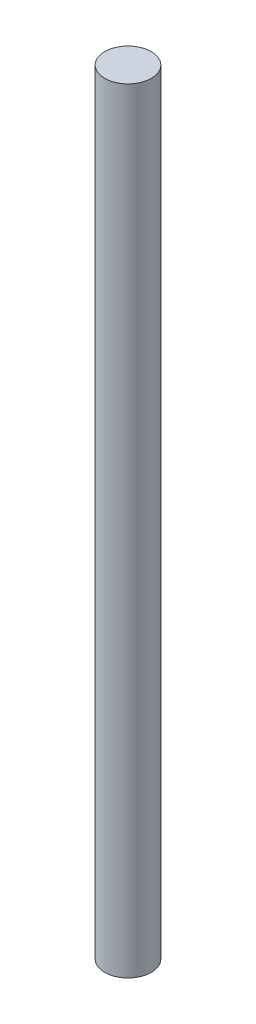
ISO-10303-21;
HEADER;
FILE_DESCRIPTION(('STEP AP214'),'2;1');
FILE_NAME('part.step','',(''),(''),'','','');
FILE_SCHEMA(('AUTOMOTIVE_DESIGN { 1 0 10303 214 1 1 1 1 }'));
ENDSEC;
DATA;
#1=APPLICATION_CONTEXT('core data for automotive mechanical design processes');
#2=APPLICATION_PROTOCOL_DEFINITION('international standard','automotive_design',2000,#1);
#3=PRODUCT_CONTEXT('',#1,'mechanical');
#4=PRODUCT('Part','Part','',(#3));
#5=PRODUCT_RELATED_PRODUCT_CATEGORY('part','',(#4));
#6=PRODUCT_DEFINITION_FORMATION('','',#4);
#7=PRODUCT_DEFINITION_CONTEXT('part definition',#1,'design');
#8=PRODUCT_DEFINITION('design','',#6,#7);
#9=PRODUCT_DEFINITION_SHAPE('','',#8);
#10=(LENGTH_UNIT() NAMED_UNIT(*) SI_UNIT(.MILLI.,.METRE.));
#11=(NAMED_UNIT(*) PLANE_ANGLE_UNIT() SI_UNIT($,.RADIAN.));
#12=(NAMED_UNIT(*) SI_UNIT($,.STERADIAN.) SOLID_ANGLE_UNIT());
#13=UNCERTAINTY_MEASURE_WITH_UNIT(LENGTH_MEASURE(1.E-05),#10,'distance_accuracy_value','');
#14=(GEOMETRIC_REPRESENTATION_CONTEXT(3) GLOBAL_UNCERTAINTY_ASSIGNED_CONTEXT((#13)) GLOBAL_UNIT_ASSIGNED_CONTEXT((#10,
#11,#12)) REPRESENTATION_CONTEXT('',''));
#15=CARTESIAN_POINT('',(0.,0.,0.));
#16=DIRECTION('',(0.,0.,1.));
#17=DIRECTION('',(1.,0.,0.));
#18=AXIS2_PLACEMENT_3D('',#15,#16,#17);
#19=CARTESIAN_POINT('',(0.,250.,0.));
#20=DIRECTION('',(0.,-1.,0.));
#21=DIRECTION('',(0.,0.,-1.));
#22=AXIS2_PLACEMENT_3D('',#19,#20,#21);
#23=CYLINDRICAL_SURFACE('',#22,7.5);
#24=CARTESIAN_POINT('',(0.,250.,0.));
#25=DIRECTION('',(0.,1.,0.));
#26=DIRECTION('',(0.,0.,1.));
#27=AXIS2_PLACEMENT_3D('',#24,#25,#26);
#28=CIRCLE('',#27,7.5);
#29=CARTESIAN_POINT('',(0.,250.,7.5));
#30=VERTEX_POINT('',#29);
#31=EDGE_CURVE('E10',#30,#30,#28,.T.);
#32=ORIENTED_EDGE('',*,*,#31,.F.);
#33=EDGE_LOOP('',(#32));
#34=FACE_BOUND('',#33,.T.);
#35=CARTESIAN_POINT('',(0.,0.,0.));
#36=DIRECTION('',(0.,1.,0.));
#37=DIRECTION('',(0.,0.,1.));
#38=AXIS2_PLACEMENT_3D('',#35,#36,#37);
#39=CIRCLE('',#38,7.5);
#40=CARTESIAN_POINT('',(0.,0.,7.5));
#41=VERTEX_POINT('',#40);
#42=EDGE_CURVE('E34',#41,#41,#39,.T.);
#43=ORIENTED_EDGE('',*,*,#42,.T.);
#44=EDGE_LOOP('',(#43));
#45=FACE_BOUND('',#44,.T.);
#46=ADVANCED_FACE('F31',(#34,#45),#23,.T.);
#47=CARTESIAN_POINT('',(0.,250.,0.));
#48=DIRECTION('',(0.,1.,0.));
#49=DIRECTION('',(0.,0.,1.));
#50=AXIS2_PLACEMENT_3D('',#47,#48,#49);
#51=PLANE('',#50);
#52=ORIENTED_EDGE('',*,*,#31,.T.);
#53=EDGE_LOOP('',(#52));
#54=FACE_BOUND('',#53,.T.);
#55=ADVANCED_FACE('F46',(#54),#51,.T.);
#56=CARTESIAN_POINT('',(0.,0.,0.));
#57=DIRECTION('',(0.,1.,0.));
#58=DIRECTION('',(0.,0.,1.));
#59=AXIS2_PLACEMENT_3D('',#56,#57,#58);
#60=PLANE('',#59);
#61=ORIENTED_EDGE('',*,*,#42,.F.);
#62=EDGE_LOOP('',(#61));
#63=FACE_BOUND('',#62,.T.);
#64=ADVANCED_FACE('F44',(#63),#60,.F.);
#65=CLOSED_SHELL('',(#46,#55,#64));
#66=MANIFOLD_SOLID_BREP('B2',#65);
#67=ADVANCED_BREP_SHAPE_REPRESENTATION('',(#18,#66),#14);
#68=SHAPE_DEFINITION_REPRESENTATION(#9,#67);
ENDSEC;
END-ISO-10303-21;
